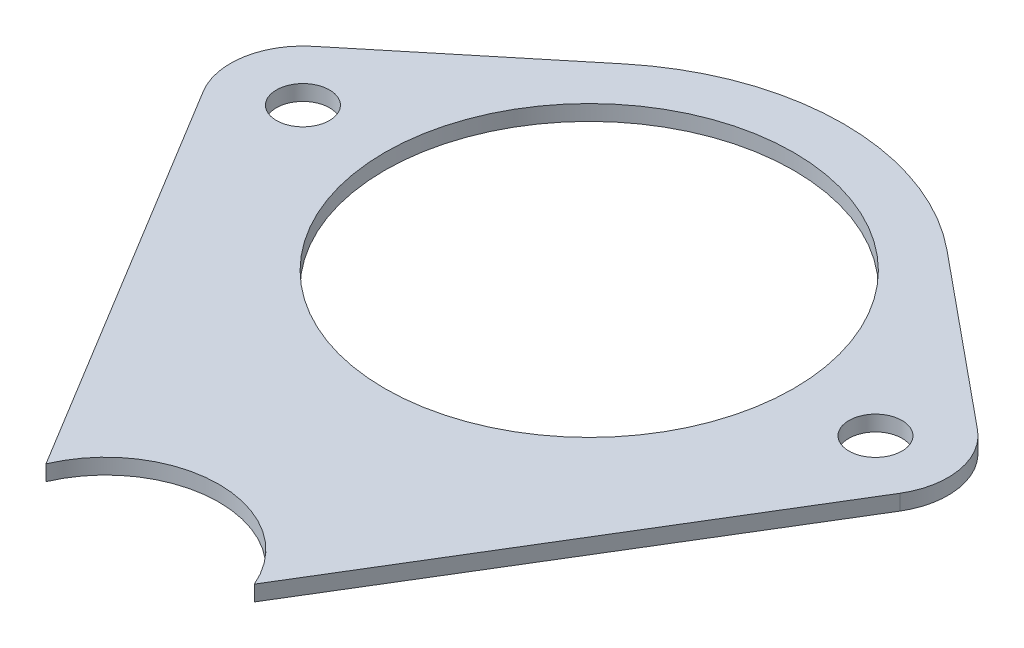
ISO-10303-21;
HEADER;
FILE_DESCRIPTION(('STEP AP214'),'2;1');
FILE_NAME('part.step','',(''),(''),'','','');
FILE_SCHEMA(('AUTOMOTIVE_DESIGN { 1 0 10303 214 1 1 1 1 }'));
ENDSEC;
DATA;
#1=APPLICATION_CONTEXT('core data for automotive mechanical design processes');
#2=APPLICATION_PROTOCOL_DEFINITION('international standard','automotive_design',2000,#1);
#3=PRODUCT_CONTEXT('',#1,'mechanical');
#4=PRODUCT('Part','Part','',(#3));
#5=PRODUCT_RELATED_PRODUCT_CATEGORY('part','',(#4));
#6=PRODUCT_DEFINITION_FORMATION('','',#4);
#7=PRODUCT_DEFINITION_CONTEXT('part definition',#1,'design');
#8=PRODUCT_DEFINITION('design','',#6,#7);
#9=PRODUCT_DEFINITION_SHAPE('','',#8);
#10=(LENGTH_UNIT() NAMED_UNIT(*) SI_UNIT(.MILLI.,.METRE.));
#11=(NAMED_UNIT(*) PLANE_ANGLE_UNIT() SI_UNIT($,.RADIAN.));
#12=(NAMED_UNIT(*) SI_UNIT($,.STERADIAN.) SOLID_ANGLE_UNIT());
#13=UNCERTAINTY_MEASURE_WITH_UNIT(LENGTH_MEASURE(1.E-05),#10,'distance_accuracy_value','');
#14=(GEOMETRIC_REPRESENTATION_CONTEXT(3) GLOBAL_UNCERTAINTY_ASSIGNED_CONTEXT((#13)) GLOBAL_UNIT_ASSIGNED_CONTEXT((#10,
#11,#12)) REPRESENTATION_CONTEXT('',''));
#15=CARTESIAN_POINT('',(0.,0.,0.));
#16=DIRECTION('',(0.,0.,1.));
#17=DIRECTION('',(1.,0.,0.));
#18=AXIS2_PLACEMENT_3D('',#15,#16,#17);
#19=CARTESIAN_POINT('',(0.,-1.778,0.));
#20=DIRECTION('',(0.,1.,0.));
#21=DIRECTION('',(0.,0.,1.));
#22=AXIS2_PLACEMENT_3D('',#19,#20,#21);
#23=CYLINDRICAL_SURFACE('',#22,13.0175);
#24=DIRECTION('',(0.,1.,0.));
#25=VECTOR('',#24,1.);
#26=CARTESIAN_POINT('',(11.9705024409877,-1.778,-5.11491716064955));
#27=LINE('',#26,#25);
#28=CARTESIAN_POINT('',(11.9705024409877,-1.778,-5.11491716064955));
#29=VERTEX_POINT('',#28);
#30=CARTESIAN_POINT('',(11.9705024409877,0.,-5.11491716064956));
#31=VERTEX_POINT('',#30);
#32=EDGE_CURVE('E33',#29,#31,#27,.T.);
#33=ORIENTED_EDGE('',*,*,#32,.T.);
#34=CARTESIAN_POINT('',(0.,0.,0.));
#35=DIRECTION('',(0.,1.,0.));
#36=DIRECTION('',(1.,0.,0.));
#37=AXIS2_PLACEMENT_3D('',#34,#35,#36);
#38=CIRCLE('',#37,13.0175);
#39=CARTESIAN_POINT('',(-11.9705024409877,0.,-5.11491716064956));
#40=VERTEX_POINT('',#39);
#41=EDGE_CURVE('E143',#31,#40,#38,.T.);
#42=ORIENTED_EDGE('',*,*,#41,.T.);
#43=DIRECTION('',(0.,1.,0.));
#44=VECTOR('',#43,1.);
#45=CARTESIAN_POINT('',(-11.9705024409877,-1.778,-5.11491716064956));
#46=LINE('',#45,#44);
#47=CARTESIAN_POINT('',(-11.9705024409877,-1.778,-5.11491716064956));
#48=VERTEX_POINT('',#47);
#49=EDGE_CURVE('E181',#48,#40,#46,.T.);
#50=ORIENTED_EDGE('',*,*,#49,.F.);
#51=CARTESIAN_POINT('',(0.,-1.778,0.));
#52=DIRECTION('',(0.,1.,0.));
#53=DIRECTION('',(1.,0.,0.));
#54=AXIS2_PLACEMENT_3D('',#51,#52,#53);
#55=CIRCLE('',#54,13.0175);
#56=EDGE_CURVE('E19',#29,#48,#55,.T.);
#57=ORIENTED_EDGE('',*,*,#56,.F.);
#58=EDGE_LOOP('',(#33,#42,#50,#57));
#59=FACE_BOUND('',#58,.T.);
#60=ADVANCED_FACE('F15',(#59),#23,.F.);
#61=CARTESIAN_POINT('',(32.893,-1.778,-55.5625));
#62=DIRECTION('',(0.,-1.,0.));
#63=DIRECTION('',(0.,0.,-1.));
#64=AXIS2_PLACEMENT_3D('',#61,#62,#63);
#65=PLANE('',#64);
#66=ORIENTED_EDGE('',*,*,#56,.T.);
#67=DIRECTION('',(-0.519521159643242,0.,-0.854457585069581));
#68=VECTOR('',#67,1.);
#69=CARTESIAN_POINT('',(-40.0116570327317,-1.778,-51.2342653147802));
#70=LINE('',#69,#68);
#71=CARTESIAN_POINT('',(-40.0116570327317,-1.778,-51.2342653147802));
#72=VERTEX_POINT('',#71);
#73=EDGE_CURVE('E99',#48,#72,#70,.T.);
#74=ORIENTED_EDGE('',*,*,#73,.T.);
#75=CARTESIAN_POINT('',(-32.893,-1.778,-55.5625));
#76=DIRECTION('',(0.,-1.,0.));
#77=DIRECTION('',(1.,0.,0.));
#78=AXIS2_PLACEMENT_3D('',#75,#76,#77);
#79=CIRCLE('',#78,8.3312);
#80=CARTESIAN_POINT('',(-38.1812211583012,-1.778,-62.0001711954631));
#81=VERTEX_POINT('',#80);
#82=EDGE_CURVE('E91',#72,#81,#79,.T.);
#83=ORIENTED_EDGE('',*,*,#82,.T.);
#84=DIRECTION('',(0.772718359355573,0.,-0.634749034749035));
#85=VECTOR('',#84,1.);
#86=CARTESIAN_POINT('',(-38.1812211583011,-1.778,-62.0001711954631));
#87=LINE('',#86,#85);
#88=CARTESIAN_POINT('',(-18.5410193050193,-1.778,-78.1336032767763));
#89=VERTEX_POINT('',#88);
#90=EDGE_CURVE('E96',#81,#89,#87,.T.);
#91=ORIENTED_EDGE('',*,*,#90,.T.);
#92=CARTESIAN_POINT('',(0.,-1.778,-55.5625));
#93=DIRECTION('',(0.,-1.,0.));
#94=DIRECTION('',(1.,0.,0.));
#95=AXIS2_PLACEMENT_3D('',#92,#93,#94);
#96=CIRCLE('',#95,29.21);
#97=CARTESIAN_POINT('',(18.5410193050193,-1.778,-78.1336032767763));
#98=VERTEX_POINT('',#97);
#99=EDGE_CURVE('E42',#89,#98,#96,.T.);
#100=ORIENTED_EDGE('',*,*,#99,.T.);
#101=DIRECTION('',(0.772718359355573,0.,0.634749034749035));
#102=VECTOR('',#101,1.);
#103=CARTESIAN_POINT('',(38.1812211583011,-1.778,-62.0001711954631));
#104=LINE('',#103,#102);
#105=CARTESIAN_POINT('',(38.1812211583011,-1.778,-62.0001711954631));
#106=VERTEX_POINT('',#105);
#107=EDGE_CURVE('E120',#98,#106,#104,.T.);
#108=ORIENTED_EDGE('',*,*,#107,.T.);
#109=CARTESIAN_POINT('',(32.893,-1.778,-55.5625));
#110=DIRECTION('',(0.,-1.,0.));
#111=DIRECTION('',(-1.,0.,0.));
#112=AXIS2_PLACEMENT_3D('',#109,#110,#111);
#113=CIRCLE('',#112,8.33119999999999);
#114=CARTESIAN_POINT('',(40.0116570327317,-1.778,-51.2342653147802));
#115=VERTEX_POINT('',#114);
#116=EDGE_CURVE('E78',#106,#115,#113,.T.);
#117=ORIENTED_EDGE('',*,*,#116,.T.);
#118=DIRECTION('',(-0.519521159643242,0.,0.854457585069581));
#119=VECTOR('',#118,1.);
#120=CARTESIAN_POINT('',(40.0116570327317,-1.778,-51.2342653147802));
#121=LINE('',#120,#119);
#122=EDGE_CURVE('E188',#115,#29,#121,.T.);
#123=ORIENTED_EDGE('',*,*,#122,.T.);
#124=EDGE_LOOP('',(#66,#74,#83,#91,#100,#108,#117,#123));
#125=FACE_BOUND('',#124,.T.);
#126=CARTESIAN_POINT('',(32.893,-1.778,-55.5625));
#127=DIRECTION('',(0.,-1.,0.));
#128=DIRECTION('',(1.,0.,0.));
#129=AXIS2_PLACEMENT_3D('',#126,#127,#128);
#130=CIRCLE('',#129,3.048);
#131=CARTESIAN_POINT('',(35.941,-1.778,-55.5625));
#132=VERTEX_POINT('',#131);
#133=EDGE_CURVE('E128',#132,#132,#130,.T.);
#134=ORIENTED_EDGE('',*,*,#133,.F.);
#135=EDGE_LOOP('',(#134));
#136=FACE_BOUND('',#135,.T.);
#137=CARTESIAN_POINT('',(0.,-1.778,-55.5625));
#138=DIRECTION('',(0.,-1.,0.));
#139=DIRECTION('',(1.,0.,0.));
#140=AXIS2_PLACEMENT_3D('',#137,#138,#139);
#141=CIRCLE('',#140,23.495);
#142=CARTESIAN_POINT('',(23.495,-1.778,-55.5625));
#143=VERTEX_POINT('',#142);
#144=EDGE_CURVE('E116',#143,#143,#141,.T.);
#145=ORIENTED_EDGE('',*,*,#144,.F.);
#146=EDGE_LOOP('',(#145));
#147=FACE_BOUND('',#146,.T.);
#148=CARTESIAN_POINT('',(-32.893,-1.778,-55.5625));
#149=DIRECTION('',(0.,1.,0.));
#150=DIRECTION('',(1.,0.,0.));
#151=AXIS2_PLACEMENT_3D('',#148,#149,#150);
#152=CIRCLE('',#151,3.048);
#153=CARTESIAN_POINT('',(-29.845,-1.778,-55.5625));
#154=VERTEX_POINT('',#153);
#155=EDGE_CURVE('E125',#154,#154,#152,.T.);
#156=ORIENTED_EDGE('',*,*,#155,.T.);
#157=EDGE_LOOP('',(#156));
#158=FACE_BOUND('',#157,.T.);
#159=ADVANCED_FACE('F93',(#125,#136,#147,#158),#65,.T.);
#160=CARTESIAN_POINT('',(32.893,0.,-55.5625));
#161=DIRECTION('',(0.,-1.,0.));
#162=DIRECTION('',(0.,0.,-1.));
#163=AXIS2_PLACEMENT_3D('',#160,#161,#162);
#164=PLANE('',#163);
#165=ORIENTED_EDGE('',*,*,#41,.F.);
#166=DIRECTION('',(-0.519521159643242,0.,0.854457585069581));
#167=VECTOR('',#166,1.);
#168=CARTESIAN_POINT('',(40.0116570327317,0.,-51.2342653147802));
#169=LINE('',#168,#167);
#170=CARTESIAN_POINT('',(40.0116570327317,0.,-51.2342653147802));
#171=VERTEX_POINT('',#170);
#172=EDGE_CURVE('E135',#171,#31,#169,.T.);
#173=ORIENTED_EDGE('',*,*,#172,.F.);
#174=CARTESIAN_POINT('',(32.893,0.,-55.5625));
#175=DIRECTION('',(0.,-1.,0.));
#176=DIRECTION('',(-1.,0.,0.));
#177=AXIS2_PLACEMENT_3D('',#174,#175,#176);
#178=CIRCLE('',#177,8.33119999999999);
#179=CARTESIAN_POINT('',(38.1812211583011,0.,-62.0001711954631));
#180=VERTEX_POINT('',#179);
#181=EDGE_CURVE('E132',#180,#171,#178,.T.);
#182=ORIENTED_EDGE('',*,*,#181,.F.);
#183=DIRECTION('',(0.772718359355573,0.,0.634749034749035));
#184=VECTOR('',#183,1.);
#185=CARTESIAN_POINT('',(38.1812211583011,0.,-62.0001711954631));
#186=LINE('',#185,#184);
#187=CARTESIAN_POINT('',(18.5410193050193,0.,-78.1336032767763));
#188=VERTEX_POINT('',#187);
#189=EDGE_CURVE('E136',#188,#180,#186,.T.);
#190=ORIENTED_EDGE('',*,*,#189,.F.);
#191=CARTESIAN_POINT('',(0.,0.,-55.5625));
#192=DIRECTION('',(0.,-1.,0.));
#193=DIRECTION('',(1.,0.,0.));
#194=AXIS2_PLACEMENT_3D('',#191,#192,#193);
#195=CIRCLE('',#194,29.21);
#196=CARTESIAN_POINT('',(-18.5410193050193,0.,-78.1336032767763));
#197=VERTEX_POINT('',#196);
#198=EDGE_CURVE('E70',#197,#188,#195,.T.);
#199=ORIENTED_EDGE('',*,*,#198,.F.);
#200=DIRECTION('',(0.772718359355573,0.,-0.634749034749035));
#201=VECTOR('',#200,1.);
#202=CARTESIAN_POINT('',(-38.1812211583011,0.,-62.0001711954631));
#203=LINE('',#202,#201);
#204=CARTESIAN_POINT('',(-38.1812211583012,0.,-62.0001711954631));
#205=VERTEX_POINT('',#204);
#206=EDGE_CURVE('E158',#205,#197,#203,.T.);
#207=ORIENTED_EDGE('',*,*,#206,.F.);
#208=CARTESIAN_POINT('',(-32.893,0.,-55.5625));
#209=DIRECTION('',(0.,-1.,0.));
#210=DIRECTION('',(1.,0.,0.));
#211=AXIS2_PLACEMENT_3D('',#208,#209,#210);
#212=CIRCLE('',#211,8.3312);
#213=CARTESIAN_POINT('',(-40.0116570327317,0.,-51.2342653147802));
#214=VERTEX_POINT('',#213);
#215=EDGE_CURVE('E108',#214,#205,#212,.T.);
#216=ORIENTED_EDGE('',*,*,#215,.F.);
#217=DIRECTION('',(-0.519521159643242,0.,-0.854457585069581));
#218=VECTOR('',#217,1.);
#219=CARTESIAN_POINT('',(-40.0116570327317,0.,-51.2342653147802));
#220=LINE('',#219,#218);
#221=EDGE_CURVE('E146',#40,#214,#220,.T.);
#222=ORIENTED_EDGE('',*,*,#221,.F.);
#223=EDGE_LOOP('',(#165,#173,#182,#190,#199,#207,#216,#222));
#224=FACE_BOUND('',#223,.T.);
#225=CARTESIAN_POINT('',(32.893,0.,-55.5625));
#226=DIRECTION('',(0.,-1.,0.));
#227=DIRECTION('',(1.,0.,0.));
#228=AXIS2_PLACEMENT_3D('',#225,#226,#227);
#229=CIRCLE('',#228,3.048);
#230=CARTESIAN_POINT('',(35.941,0.,-55.5625));
#231=VERTEX_POINT('',#230);
#232=EDGE_CURVE('E122',#231,#231,#229,.T.);
#233=ORIENTED_EDGE('',*,*,#232,.T.);
#234=EDGE_LOOP('',(#233));
#235=FACE_BOUND('',#234,.T.);
#236=CARTESIAN_POINT('',(0.,0.,-55.5625));
#237=DIRECTION('',(0.,-1.,0.));
#238=DIRECTION('',(1.,0.,0.));
#239=AXIS2_PLACEMENT_3D('',#236,#237,#238);
#240=CIRCLE('',#239,23.495);
#241=CARTESIAN_POINT('',(23.495,0.,-55.5625));
#242=VERTEX_POINT('',#241);
#243=EDGE_CURVE('E165',#242,#242,#240,.T.);
#244=ORIENTED_EDGE('',*,*,#243,.T.);
#245=EDGE_LOOP('',(#244));
#246=FACE_BOUND('',#245,.T.);
#247=CARTESIAN_POINT('',(-32.893,0.,-55.5625));
#248=DIRECTION('',(0.,1.,0.));
#249=DIRECTION('',(1.,0.,0.));
#250=AXIS2_PLACEMENT_3D('',#247,#248,#249);
#251=CIRCLE('',#250,3.048);
#252=CARTESIAN_POINT('',(-29.845,0.,-55.5625));
#253=VERTEX_POINT('',#252);
#254=EDGE_CURVE('E171',#253,#253,#251,.T.);
#255=ORIENTED_EDGE('',*,*,#254,.F.);
#256=EDGE_LOOP('',(#255));
#257=FACE_BOUND('',#256,.T.);
#258=ADVANCED_FACE('F190',(#224,#235,#246,#257),#164,.F.);
#259=CARTESIAN_POINT('',(38.1812211583011,-1.778,-62.0001711954631));
#260=DIRECTION('',(-0.634749034749035,0.,0.772718359355573));
#261=DIRECTION('',(0.772718359355573,0.,0.634749034749035));
#262=AXIS2_PLACEMENT_3D('',#259,#260,#261);
#263=PLANE('',#262);
#264=ORIENTED_EDGE('',*,*,#189,.T.);
#265=DIRECTION('',(0.,1.,0.));
#266=VECTOR('',#265,1.);
#267=CARTESIAN_POINT('',(38.1812211583011,-1.778,-62.0001711954631));
#268=LINE('',#267,#266);
#269=EDGE_CURVE('E9',#106,#180,#268,.T.);
#270=ORIENTED_EDGE('',*,*,#269,.F.);
#271=ORIENTED_EDGE('',*,*,#107,.F.);
#272=DIRECTION('',(0.,1.,0.));
#273=VECTOR('',#272,1.);
#274=CARTESIAN_POINT('',(18.5410193050193,-1.778,-78.1336032767763));
#275=LINE('',#274,#273);
#276=EDGE_CURVE('E131',#98,#188,#275,.T.);
#277=ORIENTED_EDGE('',*,*,#276,.T.);
#278=EDGE_LOOP('',(#264,#270,#271,#277));
#279=FACE_BOUND('',#278,.T.);
#280=ADVANCED_FACE('F17',(#279),#263,.F.);
#281=CARTESIAN_POINT('',(32.893,-1.778,-55.5625));
#282=DIRECTION('',(0.,1.,0.));
#283=DIRECTION('',(0.,0.,1.));
#284=AXIS2_PLACEMENT_3D('',#281,#282,#283);
#285=CYLINDRICAL_SURFACE('',#284,8.33119999999999);
#286=ORIENTED_EDGE('',*,*,#181,.T.);
#287=DIRECTION('',(0.,1.,0.));
#288=VECTOR('',#287,1.);
#289=CARTESIAN_POINT('',(40.0116570327317,-1.778,-51.2342653147802));
#290=LINE('',#289,#288);
#291=EDGE_CURVE('E25',#115,#171,#290,.T.);
#292=ORIENTED_EDGE('',*,*,#291,.F.);
#293=ORIENTED_EDGE('',*,*,#116,.F.);
#294=ORIENTED_EDGE('',*,*,#269,.T.);
#295=EDGE_LOOP('',(#286,#292,#293,#294));
#296=FACE_BOUND('',#295,.T.);
#297=ADVANCED_FACE('F209',(#296),#285,.T.);
#298=CARTESIAN_POINT('',(40.0116570327317,-1.778,-51.2342653147802));
#299=DIRECTION('',(-0.854457585069581,0.,-0.519521159643242));
#300=DIRECTION('',(-0.519521159643242,0.,0.854457585069581));
#301=AXIS2_PLACEMENT_3D('',#298,#299,#300);
#302=PLANE('',#301);
#303=ORIENTED_EDGE('',*,*,#172,.T.);
#304=ORIENTED_EDGE('',*,*,#32,.F.);
#305=ORIENTED_EDGE('',*,*,#122,.F.);
#306=ORIENTED_EDGE('',*,*,#291,.T.);
#307=EDGE_LOOP('',(#303,#304,#305,#306));
#308=FACE_BOUND('',#307,.T.);
#309=ADVANCED_FACE('F187',(#308),#302,.F.);
#310=CARTESIAN_POINT('',(-40.0116570327317,-1.778,-51.2342653147802));
#311=DIRECTION('',(0.854457585069581,0.,-0.519521159643242));
#312=DIRECTION('',(-0.519521159643242,0.,-0.854457585069581));
#313=AXIS2_PLACEMENT_3D('',#310,#311,#312);
#314=PLANE('',#313);
#315=ORIENTED_EDGE('',*,*,#221,.T.);
#316=DIRECTION('',(0.,1.,0.));
#317=VECTOR('',#316,1.);
#318=CARTESIAN_POINT('',(-40.0116570327317,-1.778,-51.2342653147802));
#319=LINE('',#318,#317);
#320=EDGE_CURVE('E111',#72,#214,#319,.T.);
#321=ORIENTED_EDGE('',*,*,#320,.F.);
#322=ORIENTED_EDGE('',*,*,#73,.F.);
#323=ORIENTED_EDGE('',*,*,#49,.T.);
#324=EDGE_LOOP('',(#315,#321,#322,#323));
#325=FACE_BOUND('',#324,.T.);
#326=ADVANCED_FACE('F200',(#325),#314,.F.);
#327=CARTESIAN_POINT('',(-32.893,-1.778,-55.5625));
#328=DIRECTION('',(0.,1.,0.));
#329=DIRECTION('',(0.,0.,1.));
#330=AXIS2_PLACEMENT_3D('',#327,#328,#329);
#331=CYLINDRICAL_SURFACE('',#330,8.3312);
#332=ORIENTED_EDGE('',*,*,#215,.T.);
#333=DIRECTION('',(0.,1.,0.));
#334=VECTOR('',#333,1.);
#335=CARTESIAN_POINT('',(-38.1812211583012,-1.778,-62.0001711954631));
#336=LINE('',#335,#334);
#337=EDGE_CURVE('E105',#81,#205,#336,.T.);
#338=ORIENTED_EDGE('',*,*,#337,.F.);
#339=ORIENTED_EDGE('',*,*,#82,.F.);
#340=ORIENTED_EDGE('',*,*,#320,.T.);
#341=EDGE_LOOP('',(#332,#338,#339,#340));
#342=FACE_BOUND('',#341,.T.);
#343=ADVANCED_FACE('F106',(#342),#331,.T.);
#344=CARTESIAN_POINT('',(-38.1812211583011,-1.778,-62.0001711954631));
#345=DIRECTION('',(0.634749034749035,0.,0.772718359355573));
#346=DIRECTION('',(0.772718359355573,0.,-0.634749034749035));
#347=AXIS2_PLACEMENT_3D('',#344,#345,#346);
#348=PLANE('',#347);
#349=ORIENTED_EDGE('',*,*,#206,.T.);
#350=DIRECTION('',(0.,1.,0.));
#351=VECTOR('',#350,1.);
#352=CARTESIAN_POINT('',(-18.5410193050193,-1.778,-78.1336032767763));
#353=LINE('',#352,#351);
#354=EDGE_CURVE('E112',#89,#197,#353,.T.);
#355=ORIENTED_EDGE('',*,*,#354,.F.);
#356=ORIENTED_EDGE('',*,*,#90,.F.);
#357=ORIENTED_EDGE('',*,*,#337,.T.);
#358=EDGE_LOOP('',(#349,#355,#356,#357));
#359=FACE_BOUND('',#358,.T.);
#360=ADVANCED_FACE('F114',(#359),#348,.F.);
#361=CARTESIAN_POINT('',(0.,-1.778,-55.5625));
#362=DIRECTION('',(0.,1.,0.));
#363=DIRECTION('',(0.,0.,1.));
#364=AXIS2_PLACEMENT_3D('',#361,#362,#363);
#365=CYLINDRICAL_SURFACE('',#364,23.495);
#366=ORIENTED_EDGE('',*,*,#144,.T.);
#367=EDGE_LOOP('',(#366));
#368=FACE_BOUND('',#367,.T.);
#369=ORIENTED_EDGE('',*,*,#243,.F.);
#370=EDGE_LOOP('',(#369));
#371=FACE_BOUND('',#370,.T.);
#372=ADVANCED_FACE('F236',(#368,#371),#365,.F.);
#373=CARTESIAN_POINT('',(0.,-1.778,-55.5625));
#374=DIRECTION('',(0.,1.,0.));
#375=DIRECTION('',(0.,0.,1.));
#376=AXIS2_PLACEMENT_3D('',#373,#374,#375);
#377=CYLINDRICAL_SURFACE('',#376,29.21);
#378=ORIENTED_EDGE('',*,*,#198,.T.);
#379=ORIENTED_EDGE('',*,*,#276,.F.);
#380=ORIENTED_EDGE('',*,*,#99,.F.);
#381=ORIENTED_EDGE('',*,*,#354,.T.);
#382=EDGE_LOOP('',(#378,#379,#380,#381));
#383=FACE_BOUND('',#382,.T.);
#384=ADVANCED_FACE('F193',(#383),#377,.T.);
#385=CARTESIAN_POINT('',(32.893,-1.778,-55.5625));
#386=DIRECTION('',(0.,1.,0.));
#387=DIRECTION('',(0.,0.,1.));
#388=AXIS2_PLACEMENT_3D('',#385,#386,#387);
#389=CYLINDRICAL_SURFACE('',#388,3.048);
#390=ORIENTED_EDGE('',*,*,#133,.T.);
#391=EDGE_LOOP('',(#390));
#392=FACE_BOUND('',#391,.T.);
#393=ORIENTED_EDGE('',*,*,#232,.F.);
#394=EDGE_LOOP('',(#393));
#395=FACE_BOUND('',#394,.T.);
#396=ADVANCED_FACE('F228',(#392,#395),#389,.F.);
#397=CARTESIAN_POINT('',(-32.893,-1.778,-55.5625));
#398=DIRECTION('',(0.,1.,0.));
#399=DIRECTION('',(0.,0.,1.));
#400=AXIS2_PLACEMENT_3D('',#397,#398,#399);
#401=CYLINDRICAL_SURFACE('',#400,3.048);
#402=ORIENTED_EDGE('',*,*,#155,.F.);
#403=EDGE_LOOP('',(#402));
#404=FACE_BOUND('',#403,.T.);
#405=ORIENTED_EDGE('',*,*,#254,.T.);
#406=EDGE_LOOP('',(#405));
#407=FACE_BOUND('',#406,.T.);
#408=ADVANCED_FACE('F231',(#404,#407),#401,.F.);
#409=CLOSED_SHELL('',(#60,#159,#258,#280,#297,#309,#326,#343,#360,#372,#384,#396,#408));
#410=MANIFOLD_SOLID_BREP('B1',#409);
#411=ADVANCED_BREP_SHAPE_REPRESENTATION('',(#18,#410),#14);
#412=SHAPE_DEFINITION_REPRESENTATION(#9,#411);
ENDSEC;
END-ISO-10303-21;
